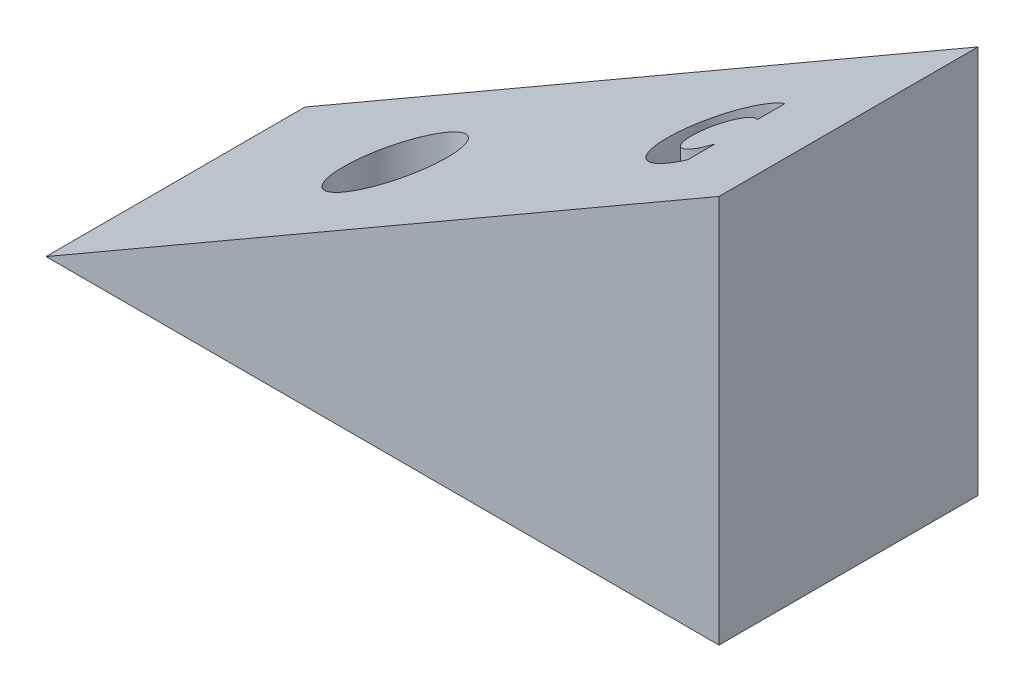
ISO-10303-21;
HEADER;
FILE_DESCRIPTION(('STEP AP214'),'2;1');
FILE_NAME('part.step','',(''),(''),'','','');
FILE_SCHEMA(('AUTOMOTIVE_DESIGN { 1 0 10303 214 1 1 1 1 }'));
ENDSEC;
DATA;
#1=APPLICATION_CONTEXT('core data for automotive mechanical design processes');
#2=APPLICATION_PROTOCOL_DEFINITION('international standard','automotive_design',2000,#1);
#3=PRODUCT_CONTEXT('',#1,'mechanical');
#4=PRODUCT('Part','Part','',(#3));
#5=PRODUCT_RELATED_PRODUCT_CATEGORY('part','',(#4));
#6=PRODUCT_DEFINITION_FORMATION('','',#4);
#7=PRODUCT_DEFINITION_CONTEXT('part definition',#1,'design');
#8=PRODUCT_DEFINITION('design','',#6,#7);
#9=PRODUCT_DEFINITION_SHAPE('','',#8);
#10=(LENGTH_UNIT() NAMED_UNIT(*) SI_UNIT(.MILLI.,.METRE.));
#11=(NAMED_UNIT(*) PLANE_ANGLE_UNIT() SI_UNIT($,.RADIAN.));
#12=(NAMED_UNIT(*) SI_UNIT($,.STERADIAN.) SOLID_ANGLE_UNIT());
#13=UNCERTAINTY_MEASURE_WITH_UNIT(LENGTH_MEASURE(1.E-05),#10,'distance_accuracy_value','');
#14=(GEOMETRIC_REPRESENTATION_CONTEXT(3) GLOBAL_UNCERTAINTY_ASSIGNED_CONTEXT((#13)) GLOBAL_UNIT_ASSIGNED_CONTEXT((#10,
#11,#12)) REPRESENTATION_CONTEXT('',''));
#15=CARTESIAN_POINT('',(0.,0.,0.));
#16=DIRECTION('',(0.,0.,1.));
#17=DIRECTION('',(1.,0.,0.));
#18=AXIS2_PLACEMENT_3D('',#15,#16,#17);
#19=CARTESIAN_POINT('',(0.,0.,20.));
#20=DIRECTION('',(0.500000000000001,-0.866025403784438,0.));
#21=DIRECTION('',(0.866025403784438,0.500000000000001,0.));
#22=AXIS2_PLACEMENT_3D('',#19,#20,#21);
#23=PLANE('',#22);
#24=CARTESIAN_POINT('',(16.9615242270663,9.79274057836311,10.));
#25=DIRECTION('',(0.500000000000001,-0.866025403784438,0.));
#26=DIRECTION('',(-0.866025403784438,-0.500000000000001,0.));
#27=AXIS2_PLACEMENT_3D('',#24,#25,#26);
#28=ELLIPSE('',#27,4.61880215351701,4.);
#29=CARTESIAN_POINT('',(12.9615242270663,7.4833395016046,10.));
#30=VERTEX_POINT('',#29);
#31=EDGE_CURVE('E36',#30,#30,#28,.T.);
#32=ORIENTED_EDGE('',*,*,#31,.T.);
#33=EDGE_LOOP('',(#32));
#34=FACE_BOUND('',#33,.T.);
#35=DIRECTION('',(0.,0.,-1.));
#36=VECTOR('',#35,1.);
#37=CARTESIAN_POINT('',(43.3012701892218,25.,20.));
#38=LINE('',#37,#36);
#39=CARTESIAN_POINT('',(43.3012701892218,25.,13.7689628224338));
#40=VERTEX_POINT('',#39);
#41=CARTESIAN_POINT('',(43.3012701892218,25.,11.6171211324103));
#42=VERTEX_POINT('',#41);
#43=EDGE_CURVE('E41',#40,#42,#38,.T.);
#44=ORIENTED_EDGE('',*,*,#43,.F.);
#45=CARTESIAN_POINT('',(41.9615242270663,24.2264973081038,10.));
#46=DIRECTION('',(0.500000000000001,-0.866025403784438,0.));
#47=DIRECTION('',(-0.866025403784438,-0.500000000000001,0.));
#48=AXIS2_PLACEMENT_3D('',#45,#46,#47);
#49=ELLIPSE('',#48,4.61880215351701,4.);
#50=CARTESIAN_POINT('',(43.3012701892218,25.,6.23103717756622));
#51=VERTEX_POINT('',#50);
#52=EDGE_CURVE('E11',#40,#51,#49,.T.);
#53=ORIENTED_EDGE('',*,*,#52,.T.);
#54=CARTESIAN_POINT('',(43.3012701892218,25.,8.38287886758968));
#55=VERTEX_POINT('',#54);
#56=EDGE_CURVE('E98',#55,#51,#38,.T.);
#57=ORIENTED_EDGE('',*,*,#56,.F.);
#58=CARTESIAN_POINT('',(41.9615242270663,24.2264973081038,10.));
#59=DIRECTION('',(0.500000000000001,-0.866025403784438,0.));
#60=DIRECTION('',(-0.866025403784438,-0.500000000000001,0.));
#61=AXIS2_PLACEMENT_3D('',#58,#59,#60);
#62=ELLIPSE('',#61,2.42487113059643,2.1);
#63=EDGE_CURVE('E88',#42,#55,#62,.T.);
#64=ORIENTED_EDGE('',*,*,#63,.F.);
#65=EDGE_LOOP('',(#44,#53,#57,#64));
#66=FACE_BOUND('',#65,.T.);
#67=DIRECTION('',(-0.866025403784438,-0.500000000000001,0.));
#68=VECTOR('',#67,1.);
#69=CARTESIAN_POINT('',(0.,0.,0.));
#70=LINE('',#69,#68);
#71=CARTESIAN_POINT('',(51.9615242270663,30.0000000000001,0.));
#72=VERTEX_POINT('',#71);
#73=CARTESIAN_POINT('',(0.,0.,0.));
#74=VERTEX_POINT('',#73);
#75=EDGE_CURVE('E116',#72,#74,#70,.T.);
#76=ORIENTED_EDGE('',*,*,#75,.T.);
#77=DIRECTION('',(0.,0.,-1.));
#78=VECTOR('',#77,1.);
#79=CARTESIAN_POINT('',(0.,0.,20.));
#80=LINE('',#79,#78);
#81=CARTESIAN_POINT('',(0.,0.,20.));
#82=VERTEX_POINT('',#81);
#83=EDGE_CURVE('E104',#82,#74,#80,.T.);
#84=ORIENTED_EDGE('',*,*,#83,.F.);
#85=DIRECTION('',(-0.866025403784438,-0.500000000000001,0.));
#86=VECTOR('',#85,1.);
#87=CARTESIAN_POINT('',(0.,0.,20.));
#88=LINE('',#87,#86);
#89=CARTESIAN_POINT('',(51.9615242270663,30.0000000000001,20.));
#90=VERTEX_POINT('',#89);
#91=EDGE_CURVE('E113',#90,#82,#88,.T.);
#92=ORIENTED_EDGE('',*,*,#91,.F.);
#93=DIRECTION('',(0.,0.,-1.));
#94=VECTOR('',#93,1.);
#95=CARTESIAN_POINT('',(51.9615242270663,30.0000000000001,20.));
#96=LINE('',#95,#94);
#97=EDGE_CURVE('E110',#90,#72,#96,.T.);
#98=ORIENTED_EDGE('',*,*,#97,.T.);
#99=EDGE_LOOP('',(#76,#84,#92,#98));
#100=FACE_BOUND('',#99,.T.);
#101=ADVANCED_FACE('F33',(#34,#66,#100),#23,.F.);
#102=CARTESIAN_POINT('',(0.,0.,20.));
#103=DIRECTION('',(0.,1.,0.));
#104=DIRECTION('',(-1.,0.,0.));
#105=AXIS2_PLACEMENT_3D('',#102,#103,#104);
#106=PLANE('',#105);
#107=CARTESIAN_POINT('',(16.9615242270663,0.,10.));
#108=DIRECTION('',(0.,-1.,0.));
#109=DIRECTION('',(1.,0.,0.));
#110=AXIS2_PLACEMENT_3D('',#107,#108,#109);
#111=CIRCLE('',#110,2.1);
#112=CARTESIAN_POINT('',(19.0615242270663,0.,10.));
#113=VERTEX_POINT('',#112);
#114=EDGE_CURVE('E119',#113,#113,#111,.T.);
#115=ORIENTED_EDGE('',*,*,#114,.F.);
#116=EDGE_LOOP('',(#115));
#117=FACE_BOUND('',#116,.T.);
#118=CARTESIAN_POINT('',(41.9615242270663,0.,10.));
#119=DIRECTION('',(0.,-1.,0.));
#120=DIRECTION('',(1.,0.,0.));
#121=AXIS2_PLACEMENT_3D('',#118,#119,#120);
#122=CIRCLE('',#121,2.1);
#123=CARTESIAN_POINT('',(44.0615242270663,0.,10.));
#124=VERTEX_POINT('',#123);
#125=EDGE_CURVE('E123',#124,#124,#122,.T.);
#126=ORIENTED_EDGE('',*,*,#125,.F.);
#127=EDGE_LOOP('',(#126));
#128=FACE_BOUND('',#127,.T.);
#129=DIRECTION('',(1.,0.,0.));
#130=VECTOR('',#129,1.);
#131=CARTESIAN_POINT('',(0.,0.,0.));
#132=LINE('',#131,#130);
#133=CARTESIAN_POINT('',(51.9615242270663,0.,0.));
#134=VERTEX_POINT('',#133);
#135=EDGE_CURVE('E114',#74,#134,#132,.T.);
#136=ORIENTED_EDGE('',*,*,#135,.T.);
#137=DIRECTION('',(0.,0.,-1.));
#138=VECTOR('',#137,1.);
#139=CARTESIAN_POINT('',(51.9615242270663,0.,20.));
#140=LINE('',#139,#138);
#141=CARTESIAN_POINT('',(51.9615242270663,0.,20.));
#142=VERTEX_POINT('',#141);
#143=EDGE_CURVE('E106',#142,#134,#140,.T.);
#144=ORIENTED_EDGE('',*,*,#143,.F.);
#145=DIRECTION('',(1.,0.,0.));
#146=VECTOR('',#145,1.);
#147=CARTESIAN_POINT('',(0.,0.,20.));
#148=LINE('',#147,#146);
#149=EDGE_CURVE('E79',#82,#142,#148,.T.);
#150=ORIENTED_EDGE('',*,*,#149,.F.);
#151=ORIENTED_EDGE('',*,*,#83,.T.);
#152=EDGE_LOOP('',(#136,#144,#150,#151));
#153=FACE_BOUND('',#152,.T.);
#154=ADVANCED_FACE('F154',(#117,#128,#153),#106,.F.);
#155=CARTESIAN_POINT('',(51.9615242270663,30.0000000000001,20.));
#156=DIRECTION('',(-1.,0.,0.));
#157=DIRECTION('',(0.,0.,1.));
#158=AXIS2_PLACEMENT_3D('',#155,#156,#157);
#159=PLANE('',#158);
#160=DIRECTION('',(0.,1.,0.));
#161=VECTOR('',#160,1.);
#162=CARTESIAN_POINT('',(51.9615242270663,30.0000000000001,0.));
#163=LINE('',#162,#161);
#164=EDGE_CURVE('E73',#134,#72,#163,.T.);
#165=ORIENTED_EDGE('',*,*,#164,.T.);
#166=ORIENTED_EDGE('',*,*,#97,.F.);
#167=DIRECTION('',(0.,1.,0.));
#168=VECTOR('',#167,1.);
#169=CARTESIAN_POINT('',(51.9615242270663,30.0000000000001,20.));
#170=LINE('',#169,#168);
#171=EDGE_CURVE('E56',#142,#90,#170,.T.);
#172=ORIENTED_EDGE('',*,*,#171,.F.);
#173=ORIENTED_EDGE('',*,*,#143,.T.);
#174=EDGE_LOOP('',(#165,#166,#172,#173));
#175=FACE_BOUND('',#174,.T.);
#176=ADVANCED_FACE('F157',(#175),#159,.F.);
#177=CARTESIAN_POINT('',(0.,0.,20.));
#178=DIRECTION('',(0.,0.,-1.));
#179=DIRECTION('',(-1.,0.,0.));
#180=AXIS2_PLACEMENT_3D('',#177,#178,#179);
#181=PLANE('',#180);
#182=ORIENTED_EDGE('',*,*,#91,.T.);
#183=ORIENTED_EDGE('',*,*,#149,.T.);
#184=ORIENTED_EDGE('',*,*,#171,.T.);
#185=EDGE_LOOP('',(#182,#183,#184));
#186=FACE_BOUND('',#185,.T.);
#187=ADVANCED_FACE('F164',(#186),#181,.F.);
#188=CARTESIAN_POINT('',(0.,0.,0.));
#189=DIRECTION('',(0.,0.,-1.));
#190=DIRECTION('',(-1.,0.,0.));
#191=AXIS2_PLACEMENT_3D('',#188,#189,#190);
#192=PLANE('',#191);
#193=ORIENTED_EDGE('',*,*,#75,.F.);
#194=ORIENTED_EDGE('',*,*,#164,.F.);
#195=ORIENTED_EDGE('',*,*,#135,.F.);
#196=EDGE_LOOP('',(#193,#194,#195));
#197=FACE_BOUND('',#196,.T.);
#198=ADVANCED_FACE('F162',(#197),#192,.T.);
#199=CARTESIAN_POINT('',(41.9615242270663,20.,10.));
#200=DIRECTION('',(0.,-1.,0.));
#201=DIRECTION('',(1.,0.,0.));
#202=AXIS2_PLACEMENT_3D('',#199,#200,#201);
#203=CYLINDRICAL_SURFACE('',#202,2.1);
#204=CARTESIAN_POINT('',(41.9615242270663,5.,10.));
#205=DIRECTION('',(0.,-1.,0.));
#206=DIRECTION('',(1.,0.,0.));
#207=AXIS2_PLACEMENT_3D('',#204,#205,#206);
#208=CIRCLE('',#207,2.1);
#209=CARTESIAN_POINT('',(44.0615242270663,5.,10.));
#210=VERTEX_POINT('',#209);
#211=EDGE_CURVE('E101',#210,#210,#208,.T.);
#212=ORIENTED_EDGE('',*,*,#211,.F.);
#213=EDGE_LOOP('',(#212));
#214=FACE_BOUND('',#213,.T.);
#215=ORIENTED_EDGE('',*,*,#125,.T.);
#216=EDGE_LOOP('',(#215));
#217=FACE_BOUND('',#216,.T.);
#218=ADVANCED_FACE('F150',(#214,#217),#203,.F.);
#219=CARTESIAN_POINT('',(16.9615242270663,20.,10.));
#220=DIRECTION('',(0.,-1.,0.));
#221=DIRECTION('',(1.,0.,0.));
#222=AXIS2_PLACEMENT_3D('',#219,#220,#221);
#223=CYLINDRICAL_SURFACE('',#222,2.1);
#224=CARTESIAN_POINT('',(16.9615242270663,5.,10.));
#225=DIRECTION('',(0.,-1.,0.));
#226=DIRECTION('',(1.,0.,0.));
#227=AXIS2_PLACEMENT_3D('',#224,#225,#226);
#228=CIRCLE('',#227,2.1);
#229=CARTESIAN_POINT('',(19.0615242270663,5.,10.));
#230=VERTEX_POINT('',#229);
#231=EDGE_CURVE('E135',#230,#230,#228,.T.);
#232=ORIENTED_EDGE('',*,*,#231,.F.);
#233=EDGE_LOOP('',(#232));
#234=FACE_BOUND('',#233,.T.);
#235=ORIENTED_EDGE('',*,*,#114,.T.);
#236=EDGE_LOOP('',(#235));
#237=FACE_BOUND('',#236,.T.);
#238=ADVANCED_FACE('F146',(#234,#237),#223,.F.);
#239=CARTESIAN_POINT('',(16.9615242270663,25.,10.));
#240=DIRECTION('',(0.,-1.,0.));
#241=DIRECTION('',(1.,0.,0.));
#242=AXIS2_PLACEMENT_3D('',#239,#240,#241);
#243=CYLINDRICAL_SURFACE('',#242,4.);
#244=CARTESIAN_POINT('',(16.9615242270663,5.,10.));
#245=DIRECTION('',(0.,-1.,0.));
#246=DIRECTION('',(1.,0.,0.));
#247=AXIS2_PLACEMENT_3D('',#244,#245,#246);
#248=CIRCLE('',#247,4.);
#249=CARTESIAN_POINT('',(20.9615242270663,5.,10.));
#250=VERTEX_POINT('',#249);
#251=EDGE_CURVE('E130',#250,#250,#248,.T.);
#252=ORIENTED_EDGE('',*,*,#251,.T.);
#253=EDGE_LOOP('',(#252));
#254=FACE_BOUND('',#253,.T.);
#255=ORIENTED_EDGE('',*,*,#31,.F.);
#256=EDGE_LOOP('',(#255));
#257=FACE_BOUND('',#256,.T.);
#258=ADVANCED_FACE('F149',(#254,#257),#243,.F.);
#259=CARTESIAN_POINT('',(16.9615242270663,5.,10.));
#260=DIRECTION('',(0.,-1.,0.));
#261=DIRECTION('',(1.,0.,0.));
#262=AXIS2_PLACEMENT_3D('',#259,#260,#261);
#263=PLANE('',#262);
#264=ORIENTED_EDGE('',*,*,#231,.T.);
#265=EDGE_LOOP('',(#264));
#266=FACE_BOUND('',#265,.T.);
#267=ORIENTED_EDGE('',*,*,#251,.F.);
#268=EDGE_LOOP('',(#267));
#269=FACE_BOUND('',#268,.T.);
#270=ADVANCED_FACE('F143',(#266,#269),#263,.F.);
#271=CARTESIAN_POINT('',(41.9615242270663,25.,10.));
#272=DIRECTION('',(0.,-1.,0.));
#273=DIRECTION('',(1.,0.,0.));
#274=AXIS2_PLACEMENT_3D('',#271,#272,#273);
#275=CYLINDRICAL_SURFACE('',#274,4.);
#276=CARTESIAN_POINT('',(41.9615242270663,5.,10.));
#277=DIRECTION('',(0.,-1.,0.));
#278=DIRECTION('',(1.,0.,0.));
#279=AXIS2_PLACEMENT_3D('',#276,#277,#278);
#280=CIRCLE('',#279,4.);
#281=CARTESIAN_POINT('',(45.9615242270663,5.,10.));
#282=VERTEX_POINT('',#281);
#283=EDGE_CURVE('E100',#282,#282,#280,.T.);
#284=ORIENTED_EDGE('',*,*,#283,.T.);
#285=EDGE_LOOP('',(#284));
#286=FACE_BOUND('',#285,.T.);
#287=CARTESIAN_POINT('',(41.9615242270663,25.,10.));
#288=DIRECTION('',(0.,-1.,0.));
#289=DIRECTION('',(1.,0.,0.));
#290=AXIS2_PLACEMENT_3D('',#287,#288,#289);
#291=CIRCLE('',#290,4.);
#292=EDGE_CURVE('E133',#51,#40,#291,.T.);
#293=ORIENTED_EDGE('',*,*,#292,.F.);
#294=ORIENTED_EDGE('',*,*,#52,.F.);
#295=EDGE_LOOP('',(#293,#294));
#296=FACE_BOUND('',#295,.T.);
#297=ADVANCED_FACE('F187',(#286,#296),#275,.F.);
#298=CARTESIAN_POINT('',(41.9615242270663,25.,10.));
#299=DIRECTION('',(0.,-1.,0.));
#300=DIRECTION('',(1.,0.,0.));
#301=AXIS2_PLACEMENT_3D('',#298,#299,#300);
#302=PLANE('',#301);
#303=ORIENTED_EDGE('',*,*,#43,.T.);
#304=CARTESIAN_POINT('',(41.9615242270663,25.,10.));
#305=DIRECTION('',(0.,-1.,0.));
#306=DIRECTION('',(1.,0.,0.));
#307=AXIS2_PLACEMENT_3D('',#304,#305,#306);
#308=CIRCLE('',#307,2.1);
#309=EDGE_CURVE('E47',#55,#42,#308,.T.);
#310=ORIENTED_EDGE('',*,*,#309,.F.);
#311=ORIENTED_EDGE('',*,*,#56,.T.);
#312=ORIENTED_EDGE('',*,*,#292,.T.);
#313=EDGE_LOOP('',(#303,#310,#311,#312));
#314=FACE_BOUND('',#313,.T.);
#315=ADVANCED_FACE('F96',(#314),#302,.T.);
#316=CARTESIAN_POINT('',(41.9615242270663,25.,10.));
#317=DIRECTION('',(0.,-1.,0.));
#318=DIRECTION('',(1.,0.,0.));
#319=AXIS2_PLACEMENT_3D('',#316,#317,#318);
#320=CYLINDRICAL_SURFACE('',#319,2.1);
#321=CARTESIAN_POINT('',(41.9615242270663,20.,10.));
#322=DIRECTION('',(0.,-1.,0.));
#323=DIRECTION('',(1.,0.,0.));
#324=AXIS2_PLACEMENT_3D('',#321,#322,#323);
#325=CIRCLE('',#324,2.1);
#326=CARTESIAN_POINT('',(44.0615242270663,20.,10.));
#327=VERTEX_POINT('',#326);
#328=EDGE_CURVE('E93',#327,#327,#325,.T.);
#329=ORIENTED_EDGE('',*,*,#328,.F.);
#330=EDGE_LOOP('',(#329));
#331=FACE_BOUND('',#330,.T.);
#332=ORIENTED_EDGE('',*,*,#63,.T.);
#333=ORIENTED_EDGE('',*,*,#309,.T.);
#334=EDGE_LOOP('',(#332,#333));
#335=FACE_BOUND('',#334,.T.);
#336=ADVANCED_FACE('F89',(#331,#335),#320,.T.);
#337=CARTESIAN_POINT('',(41.9615242270663,5.,10.));
#338=DIRECTION('',(0.,-1.,0.));
#339=DIRECTION('',(1.,0.,0.));
#340=AXIS2_PLACEMENT_3D('',#337,#338,#339);
#341=PLANE('',#340);
#342=ORIENTED_EDGE('',*,*,#211,.T.);
#343=EDGE_LOOP('',(#342));
#344=FACE_BOUND('',#343,.T.);
#345=ORIENTED_EDGE('',*,*,#283,.F.);
#346=EDGE_LOOP('',(#345));
#347=FACE_BOUND('',#346,.T.);
#348=ADVANCED_FACE('F192',(#344,#347),#341,.F.);
#349=CARTESIAN_POINT('',(41.9615242270663,20.,10.));
#350=DIRECTION('',(0.,-1.,0.));
#351=DIRECTION('',(1.,0.,0.));
#352=AXIS2_PLACEMENT_3D('',#349,#350,#351);
#353=PLANE('',#352);
#354=ORIENTED_EDGE('',*,*,#328,.T.);
#355=EDGE_LOOP('',(#354));
#356=FACE_BOUND('',#355,.T.);
#357=ADVANCED_FACE('F198',(#356),#353,.T.);
#358=CLOSED_SHELL('',(#101,#154,#176,#187,#198,#218,#238,#258,#270,#297,#315,#336,#348,#357));
#359=MANIFOLD_SOLID_BREP('B2',#358);
#360=ADVANCED_BREP_SHAPE_REPRESENTATION('',(#18,#359),#14);
#361=SHAPE_DEFINITION_REPRESENTATION(#9,#360);
ENDSEC;
END-ISO-10303-21;
